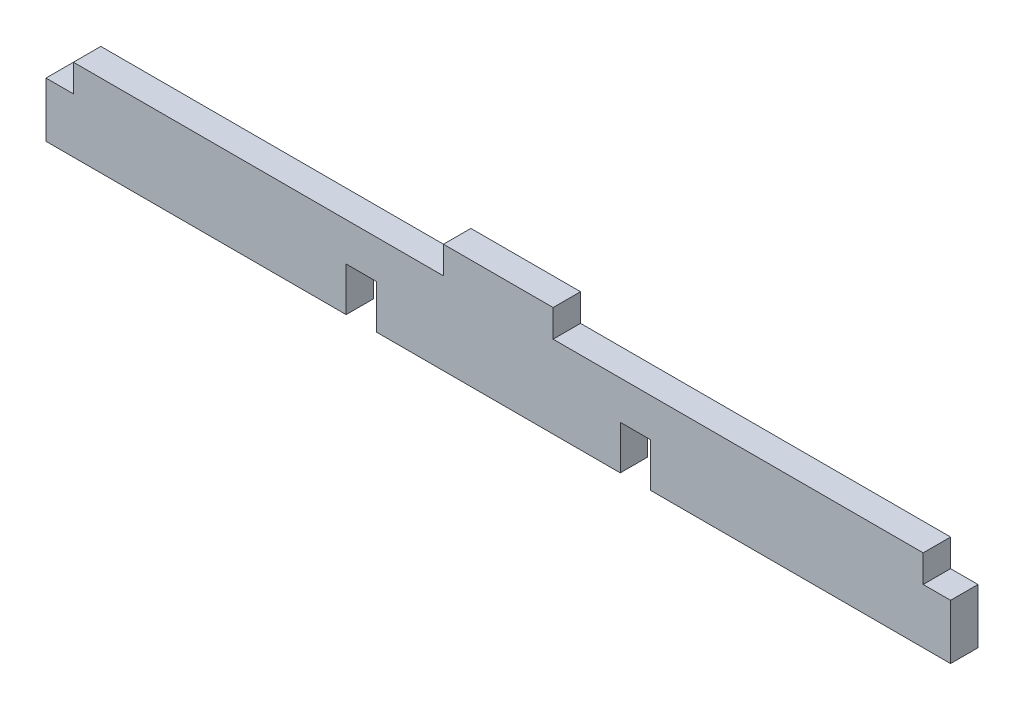
ISO-10303-21;
HEADER;
FILE_DESCRIPTION(('STEP AP214'),'2;1');
FILE_NAME('part.step','',(''),(''),'','','');
FILE_SCHEMA(('AUTOMOTIVE_DESIGN { 1 0 10303 214 1 1 1 1 }'));
ENDSEC;
DATA;
#1=APPLICATION_CONTEXT('core data for automotive mechanical design processes');
#2=APPLICATION_PROTOCOL_DEFINITION('international standard','automotive_design',2000,#1);
#3=PRODUCT_CONTEXT('',#1,'mechanical');
#4=PRODUCT('Part','Part','',(#3));
#5=PRODUCT_RELATED_PRODUCT_CATEGORY('part','',(#4));
#6=PRODUCT_DEFINITION_FORMATION('','',#4);
#7=PRODUCT_DEFINITION_CONTEXT('part definition',#1,'design');
#8=PRODUCT_DEFINITION('design','',#6,#7);
#9=PRODUCT_DEFINITION_SHAPE('','',#8);
#10=(LENGTH_UNIT() NAMED_UNIT(*) SI_UNIT(.MILLI.,.METRE.));
#11=(NAMED_UNIT(*) PLANE_ANGLE_UNIT() SI_UNIT($,.RADIAN.));
#12=(NAMED_UNIT(*) SI_UNIT($,.STERADIAN.) SOLID_ANGLE_UNIT());
#13=UNCERTAINTY_MEASURE_WITH_UNIT(LENGTH_MEASURE(1.E-05),#10,'distance_accuracy_value','');
#14=(GEOMETRIC_REPRESENTATION_CONTEXT(3) GLOBAL_UNCERTAINTY_ASSIGNED_CONTEXT((#13)) GLOBAL_UNIT_ASSIGNED_CONTEXT((#10,
#11,#12)) REPRESENTATION_CONTEXT('',''));
#15=CARTESIAN_POINT('',(0.,0.,0.));
#16=DIRECTION('',(0.,0.,1.));
#17=DIRECTION('',(1.,0.,0.));
#18=AXIS2_PLACEMENT_3D('',#15,#16,#17);
#19=CARTESIAN_POINT('',(443.795656842182,-203.645557824956,2.5));
#20=DIRECTION('',(0.,1.,0.));
#21=DIRECTION('',(0.,0.,1.));
#22=AXIS2_PLACEMENT_3D('',#19,#20,#21);
#23=PLANE('',#22);
#24=DIRECTION('',(1.,0.,0.));
#25=VECTOR('',#24,1.);
#26=CARTESIAN_POINT('',(443.795656842182,-203.645557824956,-2.5));
#27=LINE('',#26,#25);
#28=CARTESIAN_POINT('',(443.795656842182,-203.645557824956,-2.5));
#29=VERTEX_POINT('',#28);
#30=CARTESIAN_POINT('',(498.545659385881,-203.645557824956,-2.5));
#31=VERTEX_POINT('',#30);
#32=EDGE_CURVE('E200',#29,#31,#27,.T.);
#33=ORIENTED_EDGE('',*,*,#32,.T.);
#34=DIRECTION('',(0.,0.,-1.));
#35=VECTOR('',#34,1.);
#36=CARTESIAN_POINT('',(498.545659385881,-203.645557824956,2.5));
#37=LINE('',#36,#35);
#38=CARTESIAN_POINT('',(498.545659385881,-203.645557824956,2.5));
#39=VERTEX_POINT('',#38);
#40=EDGE_CURVE('E11',#39,#31,#37,.T.);
#41=ORIENTED_EDGE('',*,*,#40,.F.);
#42=DIRECTION('',(1.,0.,0.));
#43=VECTOR('',#42,1.);
#44=CARTESIAN_POINT('',(443.795656842182,-203.645557824956,2.5));
#45=LINE('',#44,#43);
#46=CARTESIAN_POINT('',(443.795656842182,-203.645557824956,2.5));
#47=VERTEX_POINT('',#46);
#48=EDGE_CURVE('E238',#47,#39,#45,.T.);
#49=ORIENTED_EDGE('',*,*,#48,.F.);
#50=DIRECTION('',(0.,0.,-1.));
#51=VECTOR('',#50,1.);
#52=CARTESIAN_POINT('',(443.795656842182,-203.645557824956,2.5));
#53=LINE('',#52,#51);
#54=EDGE_CURVE('E196',#47,#29,#53,.T.);
#55=ORIENTED_EDGE('',*,*,#54,.T.);
#56=EDGE_LOOP('',(#33,#41,#49,#55));
#57=FACE_BOUND('',#56,.T.);
#58=ADVANCED_FACE('F32',(#57),#23,.F.);
#59=CARTESIAN_POINT('',(498.545659385881,-203.645557824956,2.5));
#60=DIRECTION('',(-1.,0.,0.));
#61=DIRECTION('',(0.,0.,1.));
#62=AXIS2_PLACEMENT_3D('',#59,#60,#61);
#63=PLANE('',#62);
#64=DIRECTION('',(0.,1.,0.));
#65=VECTOR('',#64,1.);
#66=CARTESIAN_POINT('',(498.545659385881,-203.645557824956,-2.5));
#67=LINE('',#66,#65);
#68=CARTESIAN_POINT('',(498.545659385881,-193.645557824956,-2.5));
#69=VERTEX_POINT('',#68);
#70=EDGE_CURVE('E203',#31,#69,#67,.T.);
#71=ORIENTED_EDGE('',*,*,#70,.T.);
#72=DIRECTION('',(0.,0.,-1.));
#73=VECTOR('',#72,1.);
#74=CARTESIAN_POINT('',(498.545659385881,-193.645557824956,2.5));
#75=LINE('',#74,#73);
#76=CARTESIAN_POINT('',(498.545659385881,-193.645557824956,2.5));
#77=VERTEX_POINT('',#76);
#78=EDGE_CURVE('E40',#77,#69,#75,.T.);
#79=ORIENTED_EDGE('',*,*,#78,.F.);
#80=DIRECTION('',(0.,1.,0.));
#81=VECTOR('',#80,1.);
#82=CARTESIAN_POINT('',(498.545659385881,-203.645557824956,2.5));
#83=LINE('',#82,#81);
#84=EDGE_CURVE('E127',#39,#77,#83,.T.);
#85=ORIENTED_EDGE('',*,*,#84,.F.);
#86=ORIENTED_EDGE('',*,*,#40,.T.);
#87=EDGE_LOOP('',(#71,#79,#85,#86));
#88=FACE_BOUND('',#87,.T.);
#89=ADVANCED_FACE('F356',(#88),#63,.F.);
#90=CARTESIAN_POINT('',(498.545659385881,-193.645557824956,2.5));
#91=DIRECTION('',(0.,-1.,0.));
#92=DIRECTION('',(0.,0.,-1.));
#93=AXIS2_PLACEMENT_3D('',#90,#91,#92);
#94=PLANE('',#93);
#95=DIRECTION('',(-1.,0.,0.));
#96=VECTOR('',#95,1.);
#97=CARTESIAN_POINT('',(498.545659385881,-193.645557824956,-2.5));
#98=LINE('',#97,#96);
#99=CARTESIAN_POINT('',(493.545659385881,-193.645557824956,-2.5));
#100=VERTEX_POINT('',#99);
#101=EDGE_CURVE('E205',#69,#100,#98,.T.);
#102=ORIENTED_EDGE('',*,*,#101,.T.);
#103=DIRECTION('',(0.,0.,-1.));
#104=VECTOR('',#103,1.);
#105=CARTESIAN_POINT('',(493.545659385881,-193.645557824956,2.5));
#106=LINE('',#105,#104);
#107=CARTESIAN_POINT('',(493.545659385881,-193.645557824956,2.5));
#108=VERTEX_POINT('',#107);
#109=EDGE_CURVE('E281',#108,#100,#106,.T.);
#110=ORIENTED_EDGE('',*,*,#109,.F.);
#111=DIRECTION('',(-1.,0.,0.));
#112=VECTOR('',#111,1.);
#113=CARTESIAN_POINT('',(498.545659385881,-193.645557824956,2.5));
#114=LINE('',#113,#112);
#115=EDGE_CURVE('E289',#77,#108,#114,.T.);
#116=ORIENTED_EDGE('',*,*,#115,.F.);
#117=ORIENTED_EDGE('',*,*,#78,.T.);
#118=EDGE_LOOP('',(#102,#110,#116,#117));
#119=FACE_BOUND('',#118,.T.);
#120=ADVANCED_FACE('F287',(#119),#94,.F.);
#121=CARTESIAN_POINT('',(493.545659385881,-193.645557824956,2.5));
#122=DIRECTION('',(-1.,0.,0.));
#123=DIRECTION('',(0.,0.,1.));
#124=AXIS2_PLACEMENT_3D('',#121,#122,#123);
#125=PLANE('',#124);
#126=DIRECTION('',(0.,1.,0.));
#127=VECTOR('',#126,1.);
#128=CARTESIAN_POINT('',(493.545659385881,-193.645557824956,-2.5));
#129=LINE('',#128,#127);
#130=CARTESIAN_POINT('',(493.545659385881,-188.645557824956,-2.5));
#131=VERTEX_POINT('',#130);
#132=EDGE_CURVE('E207',#100,#131,#129,.T.);
#133=ORIENTED_EDGE('',*,*,#132,.T.);
#134=DIRECTION('',(0.,0.,-1.));
#135=VECTOR('',#134,1.);
#136=CARTESIAN_POINT('',(493.545659385881,-188.645557824956,2.5));
#137=LINE('',#136,#135);
#138=CARTESIAN_POINT('',(493.545659385881,-188.645557824956,2.5));
#139=VERTEX_POINT('',#138);
#140=EDGE_CURVE('E278',#139,#131,#137,.T.);
#141=ORIENTED_EDGE('',*,*,#140,.F.);
#142=DIRECTION('',(0.,1.,0.));
#143=VECTOR('',#142,1.);
#144=CARTESIAN_POINT('',(493.545659385881,-193.645557824956,2.5));
#145=LINE('',#144,#143);
#146=EDGE_CURVE('E307',#108,#139,#145,.T.);
#147=ORIENTED_EDGE('',*,*,#146,.F.);
#148=ORIENTED_EDGE('',*,*,#109,.T.);
#149=EDGE_LOOP('',(#133,#141,#147,#148));
#150=FACE_BOUND('',#149,.T.);
#151=ADVANCED_FACE('F298',(#150),#125,.F.);
#152=CARTESIAN_POINT('',(493.545659385881,-188.645557824956,2.5));
#153=DIRECTION('',(0.,-1.,0.));
#154=DIRECTION('',(0.,0.,-1.));
#155=AXIS2_PLACEMENT_3D('',#152,#153,#154);
#156=PLANE('',#155);
#157=DIRECTION('',(-1.,0.,0.));
#158=VECTOR('',#157,1.);
#159=CARTESIAN_POINT('',(493.545659385881,-188.645557824956,-2.5));
#160=LINE('',#159,#158);
#161=CARTESIAN_POINT('',(426.045659385881,-188.645557824956,-2.5));
#162=VERTEX_POINT('',#161);
#163=EDGE_CURVE('E209',#131,#162,#160,.T.);
#164=ORIENTED_EDGE('',*,*,#163,.T.);
#165=DIRECTION('',(0.,0.,-1.));
#166=VECTOR('',#165,1.);
#167=CARTESIAN_POINT('',(426.045659385881,-188.645557824956,2.5));
#168=LINE('',#167,#166);
#169=CARTESIAN_POINT('',(426.045659385881,-188.645557824956,2.5));
#170=VERTEX_POINT('',#169);
#171=EDGE_CURVE('E275',#170,#162,#168,.T.);
#172=ORIENTED_EDGE('',*,*,#171,.F.);
#173=DIRECTION('',(-1.,0.,0.));
#174=VECTOR('',#173,1.);
#175=CARTESIAN_POINT('',(493.545659385881,-188.645557824956,2.5));
#176=LINE('',#175,#174);
#177=EDGE_CURVE('E304',#139,#170,#176,.T.);
#178=ORIENTED_EDGE('',*,*,#177,.F.);
#179=ORIENTED_EDGE('',*,*,#140,.T.);
#180=EDGE_LOOP('',(#164,#172,#178,#179));
#181=FACE_BOUND('',#180,.T.);
#182=ADVANCED_FACE('F302',(#181),#156,.F.);
#183=CARTESIAN_POINT('',(426.045659385881,-188.645557824956,2.5));
#184=DIRECTION('',(-1.,0.,0.));
#185=DIRECTION('',(0.,0.,1.));
#186=AXIS2_PLACEMENT_3D('',#183,#184,#185);
#187=PLANE('',#186);
#188=DIRECTION('',(0.,1.,0.));
#189=VECTOR('',#188,1.);
#190=CARTESIAN_POINT('',(426.045659385881,-188.645557824956,-2.5));
#191=LINE('',#190,#189);
#192=CARTESIAN_POINT('',(426.045659385881,-183.645557824956,-2.5));
#193=VERTEX_POINT('',#192);
#194=EDGE_CURVE('E211',#162,#193,#191,.T.);
#195=ORIENTED_EDGE('',*,*,#194,.T.);
#196=DIRECTION('',(0.,0.,-1.));
#197=VECTOR('',#196,1.);
#198=CARTESIAN_POINT('',(426.045659385881,-183.645557824956,2.5));
#199=LINE('',#198,#197);
#200=CARTESIAN_POINT('',(426.045659385881,-183.645557824956,2.5));
#201=VERTEX_POINT('',#200);
#202=EDGE_CURVE('E272',#201,#193,#199,.T.);
#203=ORIENTED_EDGE('',*,*,#202,.F.);
#204=DIRECTION('',(0.,1.,0.));
#205=VECTOR('',#204,1.);
#206=CARTESIAN_POINT('',(426.045659385881,-188.645557824956,2.5));
#207=LINE('',#206,#205);
#208=EDGE_CURVE('E306',#170,#201,#207,.T.);
#209=ORIENTED_EDGE('',*,*,#208,.F.);
#210=ORIENTED_EDGE('',*,*,#171,.T.);
#211=EDGE_LOOP('',(#195,#203,#209,#210));
#212=FACE_BOUND('',#211,.T.);
#213=ADVANCED_FACE('F369',(#212),#187,.F.);
#214=CARTESIAN_POINT('',(426.045659385881,-183.645557824956,2.5));
#215=DIRECTION('',(0.,-1.,0.));
#216=DIRECTION('',(0.,0.,-1.));
#217=AXIS2_PLACEMENT_3D('',#214,#215,#216);
#218=PLANE('',#217);
#219=DIRECTION('',(-1.,0.,0.));
#220=VECTOR('',#219,1.);
#221=CARTESIAN_POINT('',(426.045659385881,-183.645557824956,-2.5));
#222=LINE('',#221,#220);
#223=CARTESIAN_POINT('',(406.045659385882,-183.645557824956,-2.5));
#224=VERTEX_POINT('',#223);
#225=EDGE_CURVE('E213',#193,#224,#222,.T.);
#226=ORIENTED_EDGE('',*,*,#225,.T.);
#227=DIRECTION('',(0.,0.,-1.));
#228=VECTOR('',#227,1.);
#229=CARTESIAN_POINT('',(406.045659385882,-183.645557824956,2.5));
#230=LINE('',#229,#228);
#231=CARTESIAN_POINT('',(406.045659385882,-183.645557824956,2.5));
#232=VERTEX_POINT('',#231);
#233=EDGE_CURVE('E269',#232,#224,#230,.T.);
#234=ORIENTED_EDGE('',*,*,#233,.F.);
#235=DIRECTION('',(-1.,0.,0.));
#236=VECTOR('',#235,1.);
#237=CARTESIAN_POINT('',(426.045659385881,-183.645557824956,2.5));
#238=LINE('',#237,#236);
#239=EDGE_CURVE('E309',#201,#232,#238,.T.);
#240=ORIENTED_EDGE('',*,*,#239,.F.);
#241=ORIENTED_EDGE('',*,*,#202,.T.);
#242=EDGE_LOOP('',(#226,#234,#240,#241));
#243=FACE_BOUND('',#242,.T.);
#244=ADVANCED_FACE('F372',(#243),#218,.F.);
#245=CARTESIAN_POINT('',(406.045659385882,-183.645557824956,2.5));
#246=DIRECTION('',(1.,-2.77555756156292E-13,0.));
#247=DIRECTION('',(2.77555756156292E-13,1.,0.));
#248=AXIS2_PLACEMENT_3D('',#245,#246,#247);
#249=PLANE('',#248);
#250=DIRECTION('',(-2.77555756156292E-13,-1.,0.));
#251=VECTOR('',#250,1.);
#252=CARTESIAN_POINT('',(406.045659385882,-183.645557824956,-2.5));
#253=LINE('',#252,#251);
#254=CARTESIAN_POINT('',(406.04565938588,-188.645557824956,-2.5));
#255=VERTEX_POINT('',#254);
#256=EDGE_CURVE('E215',#224,#255,#253,.T.);
#257=ORIENTED_EDGE('',*,*,#256,.T.);
#258=DIRECTION('',(0.,0.,-1.));
#259=VECTOR('',#258,1.);
#260=CARTESIAN_POINT('',(406.04565938588,-188.645557824956,2.5));
#261=LINE('',#260,#259);
#262=CARTESIAN_POINT('',(406.04565938588,-188.645557824956,2.5));
#263=VERTEX_POINT('',#262);
#264=EDGE_CURVE('E266',#263,#255,#261,.T.);
#265=ORIENTED_EDGE('',*,*,#264,.F.);
#266=DIRECTION('',(-2.77555756156292E-13,-1.,0.));
#267=VECTOR('',#266,1.);
#268=CARTESIAN_POINT('',(406.045659385882,-183.645557824956,2.5));
#269=LINE('',#268,#267);
#270=EDGE_CURVE('E315',#232,#263,#269,.T.);
#271=ORIENTED_EDGE('',*,*,#270,.F.);
#272=ORIENTED_EDGE('',*,*,#233,.T.);
#273=EDGE_LOOP('',(#257,#265,#271,#272));
#274=FACE_BOUND('',#273,.T.);
#275=ADVANCED_FACE('F376',(#274),#249,.F.);
#276=CARTESIAN_POINT('',(406.04565938588,-188.645557824956,2.5));
#277=DIRECTION('',(0.,-1.,0.));
#278=DIRECTION('',(0.,0.,-1.));
#279=AXIS2_PLACEMENT_3D('',#276,#277,#278);
#280=PLANE('',#279);
#281=DIRECTION('',(-1.,0.,0.));
#282=VECTOR('',#281,1.);
#283=CARTESIAN_POINT('',(406.04565938588,-188.645557824956,-2.5));
#284=LINE('',#283,#282);
#285=CARTESIAN_POINT('',(338.545659385881,-188.645557824956,-2.5));
#286=VERTEX_POINT('',#285);
#287=EDGE_CURVE('E217',#255,#286,#284,.T.);
#288=ORIENTED_EDGE('',*,*,#287,.T.);
#289=DIRECTION('',(0.,0.,-1.));
#290=VECTOR('',#289,1.);
#291=CARTESIAN_POINT('',(338.545659385881,-188.645557824956,2.5));
#292=LINE('',#291,#290);
#293=CARTESIAN_POINT('',(338.545659385881,-188.645557824956,2.5));
#294=VERTEX_POINT('',#293);
#295=EDGE_CURVE('E263',#294,#286,#292,.T.);
#296=ORIENTED_EDGE('',*,*,#295,.F.);
#297=DIRECTION('',(-1.,0.,0.));
#298=VECTOR('',#297,1.);
#299=CARTESIAN_POINT('',(406.04565938588,-188.645557824956,2.5));
#300=LINE('',#299,#298);
#301=EDGE_CURVE('E317',#263,#294,#300,.T.);
#302=ORIENTED_EDGE('',*,*,#301,.F.);
#303=ORIENTED_EDGE('',*,*,#264,.T.);
#304=EDGE_LOOP('',(#288,#296,#302,#303));
#305=FACE_BOUND('',#304,.T.);
#306=ADVANCED_FACE('F380',(#305),#280,.F.);
#307=CARTESIAN_POINT('',(338.545659385881,-188.645557824956,2.5));
#308=DIRECTION('',(1.,0.,0.));
#309=DIRECTION('',(0.,0.,-1.));
#310=AXIS2_PLACEMENT_3D('',#307,#308,#309);
#311=PLANE('',#310);
#312=DIRECTION('',(0.,-1.,0.));
#313=VECTOR('',#312,1.);
#314=CARTESIAN_POINT('',(338.545659385881,-188.645557824956,-2.5));
#315=LINE('',#314,#313);
#316=CARTESIAN_POINT('',(338.545659385881,-193.645557824956,-2.5));
#317=VERTEX_POINT('',#316);
#318=EDGE_CURVE('E219',#286,#317,#315,.T.);
#319=ORIENTED_EDGE('',*,*,#318,.T.);
#320=DIRECTION('',(0.,0.,-1.));
#321=VECTOR('',#320,1.);
#322=CARTESIAN_POINT('',(338.545659385881,-193.645557824956,2.5));
#323=LINE('',#322,#321);
#324=CARTESIAN_POINT('',(338.545659385881,-193.645557824956,2.5));
#325=VERTEX_POINT('',#324);
#326=EDGE_CURVE('E260',#325,#317,#323,.T.);
#327=ORIENTED_EDGE('',*,*,#326,.F.);
#328=DIRECTION('',(0.,-1.,0.));
#329=VECTOR('',#328,1.);
#330=CARTESIAN_POINT('',(338.545659385881,-188.645557824956,2.5));
#331=LINE('',#330,#329);
#332=EDGE_CURVE('E319',#294,#325,#331,.T.);
#333=ORIENTED_EDGE('',*,*,#332,.F.);
#334=ORIENTED_EDGE('',*,*,#295,.T.);
#335=EDGE_LOOP('',(#319,#327,#333,#334));
#336=FACE_BOUND('',#335,.T.);
#337=ADVANCED_FACE('F384',(#336),#311,.F.);
#338=CARTESIAN_POINT('',(338.545659385881,-193.645557824956,2.5));
#339=DIRECTION('',(0.,-1.,0.));
#340=DIRECTION('',(0.,0.,-1.));
#341=AXIS2_PLACEMENT_3D('',#338,#339,#340);
#342=PLANE('',#341);
#343=DIRECTION('',(-1.,0.,0.));
#344=VECTOR('',#343,1.);
#345=CARTESIAN_POINT('',(338.545659385881,-193.645557824956,-2.5));
#346=LINE('',#345,#344);
#347=CARTESIAN_POINT('',(333.545659385881,-193.645557824956,-2.5));
#348=VERTEX_POINT('',#347);
#349=EDGE_CURVE('E221',#317,#348,#346,.T.);
#350=ORIENTED_EDGE('',*,*,#349,.T.);
#351=DIRECTION('',(0.,0.,-1.));
#352=VECTOR('',#351,1.);
#353=CARTESIAN_POINT('',(333.545659385881,-193.645557824956,2.5));
#354=LINE('',#353,#352);
#355=CARTESIAN_POINT('',(333.545659385881,-193.645557824956,2.5));
#356=VERTEX_POINT('',#355);
#357=EDGE_CURVE('E257',#356,#348,#354,.T.);
#358=ORIENTED_EDGE('',*,*,#357,.F.);
#359=DIRECTION('',(-1.,0.,0.));
#360=VECTOR('',#359,1.);
#361=CARTESIAN_POINT('',(338.545659385881,-193.645557824956,2.5));
#362=LINE('',#361,#360);
#363=EDGE_CURVE('E321',#325,#356,#362,.T.);
#364=ORIENTED_EDGE('',*,*,#363,.F.);
#365=ORIENTED_EDGE('',*,*,#326,.T.);
#366=EDGE_LOOP('',(#350,#358,#364,#365));
#367=FACE_BOUND('',#366,.T.);
#368=ADVANCED_FACE('F388',(#367),#342,.F.);
#369=CARTESIAN_POINT('',(333.545659385881,-193.645557824956,2.5));
#370=DIRECTION('',(1.,0.,0.));
#371=DIRECTION('',(0.,0.,-1.));
#372=AXIS2_PLACEMENT_3D('',#369,#370,#371);
#373=PLANE('',#372);
#374=DIRECTION('',(0.,-1.,0.));
#375=VECTOR('',#374,1.);
#376=CARTESIAN_POINT('',(333.545659385881,-193.645557824956,-2.5));
#377=LINE('',#376,#375);
#378=CARTESIAN_POINT('',(333.545659385881,-203.645557824956,-2.5));
#379=VERTEX_POINT('',#378);
#380=EDGE_CURVE('E223',#348,#379,#377,.T.);
#381=ORIENTED_EDGE('',*,*,#380,.T.);
#382=DIRECTION('',(0.,0.,-1.));
#383=VECTOR('',#382,1.);
#384=CARTESIAN_POINT('',(333.545659385881,-203.645557824956,2.5));
#385=LINE('',#384,#383);
#386=CARTESIAN_POINT('',(333.545659385881,-203.645557824956,2.5));
#387=VERTEX_POINT('',#386);
#388=EDGE_CURVE('E254',#387,#379,#385,.T.);
#389=ORIENTED_EDGE('',*,*,#388,.F.);
#390=DIRECTION('',(0.,-1.,0.));
#391=VECTOR('',#390,1.);
#392=CARTESIAN_POINT('',(333.545659385881,-193.645557824956,2.5));
#393=LINE('',#392,#391);
#394=EDGE_CURVE('E323',#356,#387,#393,.T.);
#395=ORIENTED_EDGE('',*,*,#394,.F.);
#396=ORIENTED_EDGE('',*,*,#357,.T.);
#397=EDGE_LOOP('',(#381,#389,#395,#396));
#398=FACE_BOUND('',#397,.T.);
#399=ADVANCED_FACE('F392',(#398),#373,.F.);
#400=CARTESIAN_POINT('',(333.545659385881,-203.645557824956,2.5));
#401=DIRECTION('',(0.,1.,0.));
#402=DIRECTION('',(0.,0.,1.));
#403=AXIS2_PLACEMENT_3D('',#400,#401,#402);
#404=PLANE('',#403);
#405=DIRECTION('',(1.,0.,0.));
#406=VECTOR('',#405,1.);
#407=CARTESIAN_POINT('',(333.545659385881,-203.645557824956,-2.5));
#408=LINE('',#407,#406);
#409=CARTESIAN_POINT('',(388.295656842182,-203.645557824956,-2.5));
#410=VERTEX_POINT('',#409);
#411=EDGE_CURVE('E225',#379,#410,#408,.T.);
#412=ORIENTED_EDGE('',*,*,#411,.T.);
#413=DIRECTION('',(0.,0.,-1.));
#414=VECTOR('',#413,1.);
#415=CARTESIAN_POINT('',(388.295656842182,-203.645557824956,2.5));
#416=LINE('',#415,#414);
#417=CARTESIAN_POINT('',(388.295656842182,-203.645557824956,2.5));
#418=VERTEX_POINT('',#417);
#419=EDGE_CURVE('E251',#418,#410,#416,.T.);
#420=ORIENTED_EDGE('',*,*,#419,.F.);
#421=DIRECTION('',(1.,0.,0.));
#422=VECTOR('',#421,1.);
#423=CARTESIAN_POINT('',(333.545659385881,-203.645557824956,2.5));
#424=LINE('',#423,#422);
#425=EDGE_CURVE('E325',#387,#418,#424,.T.);
#426=ORIENTED_EDGE('',*,*,#425,.F.);
#427=ORIENTED_EDGE('',*,*,#388,.T.);
#428=EDGE_LOOP('',(#412,#420,#426,#427));
#429=FACE_BOUND('',#428,.T.);
#430=ADVANCED_FACE('F396',(#429),#404,.F.);
#431=CARTESIAN_POINT('',(388.295656842182,-195.645557824956,2.5));
#432=DIRECTION('',(-1.,0.,0.));
#433=DIRECTION('',(0.,0.,1.));
#434=AXIS2_PLACEMENT_3D('',#431,#432,#433);
#435=PLANE('',#434);
#436=DIRECTION('',(0.,1.,0.));
#437=VECTOR('',#436,1.);
#438=CARTESIAN_POINT('',(388.295656842182,-195.645557824956,-2.5));
#439=LINE('',#438,#437);
#440=CARTESIAN_POINT('',(388.295656842182,-195.645557824956,-2.5));
#441=VERTEX_POINT('',#440);
#442=EDGE_CURVE('E227',#410,#441,#439,.T.);
#443=ORIENTED_EDGE('',*,*,#442,.T.);
#444=DIRECTION('',(0.,0.,-1.));
#445=VECTOR('',#444,1.);
#446=CARTESIAN_POINT('',(388.295656842182,-195.645557824956,2.5));
#447=LINE('',#446,#445);
#448=CARTESIAN_POINT('',(388.295656842182,-195.645557824956,2.5));
#449=VERTEX_POINT('',#448);
#450=EDGE_CURVE('E248',#449,#441,#447,.T.);
#451=ORIENTED_EDGE('',*,*,#450,.F.);
#452=DIRECTION('',(0.,1.,0.));
#453=VECTOR('',#452,1.);
#454=CARTESIAN_POINT('',(388.295656842182,-195.645557824956,2.5));
#455=LINE('',#454,#453);
#456=EDGE_CURVE('E327',#418,#449,#455,.T.);
#457=ORIENTED_EDGE('',*,*,#456,.F.);
#458=ORIENTED_EDGE('',*,*,#419,.T.);
#459=EDGE_LOOP('',(#443,#451,#457,#458));
#460=FACE_BOUND('',#459,.T.);
#461=ADVANCED_FACE('F400',(#460),#435,.F.);
#462=CARTESIAN_POINT('',(393.795656842182,-195.645557824956,2.5));
#463=DIRECTION('',(0.,1.,0.));
#464=DIRECTION('',(0.,0.,1.));
#465=AXIS2_PLACEMENT_3D('',#462,#463,#464);
#466=PLANE('',#465);
#467=DIRECTION('',(1.,0.,0.));
#468=VECTOR('',#467,1.);
#469=CARTESIAN_POINT('',(393.795656842182,-195.645557824956,-2.5));
#470=LINE('',#469,#468);
#471=CARTESIAN_POINT('',(393.795656842182,-195.645557824956,-2.5));
#472=VERTEX_POINT('',#471);
#473=EDGE_CURVE('E229',#441,#472,#470,.T.);
#474=ORIENTED_EDGE('',*,*,#473,.T.);
#475=DIRECTION('',(0.,0.,-1.));
#476=VECTOR('',#475,1.);
#477=CARTESIAN_POINT('',(393.795656842182,-195.645557824956,2.5));
#478=LINE('',#477,#476);
#479=CARTESIAN_POINT('',(393.795656842182,-195.645557824956,2.5));
#480=VERTEX_POINT('',#479);
#481=EDGE_CURVE('E245',#480,#472,#478,.T.);
#482=ORIENTED_EDGE('',*,*,#481,.F.);
#483=DIRECTION('',(1.,0.,0.));
#484=VECTOR('',#483,1.);
#485=CARTESIAN_POINT('',(393.795656842182,-195.645557824956,2.5));
#486=LINE('',#485,#484);
#487=EDGE_CURVE('E329',#449,#480,#486,.T.);
#488=ORIENTED_EDGE('',*,*,#487,.F.);
#489=ORIENTED_EDGE('',*,*,#450,.T.);
#490=EDGE_LOOP('',(#474,#482,#488,#489));
#491=FACE_BOUND('',#490,.T.);
#492=ADVANCED_FACE('F404',(#491),#466,.F.);
#493=CARTESIAN_POINT('',(393.795656842182,-203.645557824956,2.5));
#494=DIRECTION('',(1.,0.,0.));
#495=DIRECTION('',(0.,0.,-1.));
#496=AXIS2_PLACEMENT_3D('',#493,#494,#495);
#497=PLANE('',#496);
#498=DIRECTION('',(0.,-1.,0.));
#499=VECTOR('',#498,1.);
#500=CARTESIAN_POINT('',(393.795656842182,-203.645557824956,-2.5));
#501=LINE('',#500,#499);
#502=CARTESIAN_POINT('',(393.795656842182,-203.645557824956,-2.5));
#503=VERTEX_POINT('',#502);
#504=EDGE_CURVE('E231',#472,#503,#501,.T.);
#505=ORIENTED_EDGE('',*,*,#504,.T.);
#506=DIRECTION('',(0.,0.,-1.));
#507=VECTOR('',#506,1.);
#508=CARTESIAN_POINT('',(393.795656842182,-203.645557824956,2.5));
#509=LINE('',#508,#507);
#510=CARTESIAN_POINT('',(393.795656842182,-203.645557824956,2.5));
#511=VERTEX_POINT('',#510);
#512=EDGE_CURVE('E242',#511,#503,#509,.T.);
#513=ORIENTED_EDGE('',*,*,#512,.F.);
#514=DIRECTION('',(0.,-1.,0.));
#515=VECTOR('',#514,1.);
#516=CARTESIAN_POINT('',(393.795656842182,-203.645557824956,2.5));
#517=LINE('',#516,#515);
#518=EDGE_CURVE('E331',#480,#511,#517,.T.);
#519=ORIENTED_EDGE('',*,*,#518,.F.);
#520=ORIENTED_EDGE('',*,*,#481,.T.);
#521=EDGE_LOOP('',(#505,#513,#519,#520));
#522=FACE_BOUND('',#521,.T.);
#523=ADVANCED_FACE('F337',(#522),#497,.F.);
#524=CARTESIAN_POINT('',(393.795656842182,-203.645557824956,2.5));
#525=DIRECTION('',(0.,1.,0.));
#526=DIRECTION('',(0.,0.,1.));
#527=AXIS2_PLACEMENT_3D('',#524,#525,#526);
#528=PLANE('',#527);
#529=DIRECTION('',(1.,0.,0.));
#530=VECTOR('',#529,1.);
#531=CARTESIAN_POINT('',(393.795656842182,-203.645557824956,-2.5));
#532=LINE('',#531,#530);
#533=CARTESIAN_POINT('',(438.295656842182,-203.645557824956,-2.5));
#534=VERTEX_POINT('',#533);
#535=EDGE_CURVE('E233',#503,#534,#532,.T.);
#536=ORIENTED_EDGE('',*,*,#535,.T.);
#537=DIRECTION('',(0.,0.,-1.));
#538=VECTOR('',#537,1.);
#539=CARTESIAN_POINT('',(438.295656842182,-203.645557824956,2.5));
#540=LINE('',#539,#538);
#541=CARTESIAN_POINT('',(438.295656842182,-203.645557824956,2.5));
#542=VERTEX_POINT('',#541);
#543=EDGE_CURVE('E191',#542,#534,#540,.T.);
#544=ORIENTED_EDGE('',*,*,#543,.F.);
#545=DIRECTION('',(1.,0.,0.));
#546=VECTOR('',#545,1.);
#547=CARTESIAN_POINT('',(393.795656842182,-203.645557824956,2.5));
#548=LINE('',#547,#546);
#549=EDGE_CURVE('E182',#511,#542,#548,.T.);
#550=ORIENTED_EDGE('',*,*,#549,.F.);
#551=ORIENTED_EDGE('',*,*,#512,.T.);
#552=EDGE_LOOP('',(#536,#544,#550,#551));
#553=FACE_BOUND('',#552,.T.);
#554=ADVANCED_FACE('F341',(#553),#528,.F.);
#555=CARTESIAN_POINT('',(438.295656842182,-195.645557824956,2.5));
#556=DIRECTION('',(-1.,0.,0.));
#557=DIRECTION('',(0.,0.,1.));
#558=AXIS2_PLACEMENT_3D('',#555,#556,#557);
#559=PLANE('',#558);
#560=DIRECTION('',(0.,1.,0.));
#561=VECTOR('',#560,1.);
#562=CARTESIAN_POINT('',(438.295656842182,-195.645557824956,-2.5));
#563=LINE('',#562,#561);
#564=CARTESIAN_POINT('',(438.295656842182,-195.645557824956,-2.5));
#565=VERTEX_POINT('',#564);
#566=EDGE_CURVE('E190',#534,#565,#563,.T.);
#567=ORIENTED_EDGE('',*,*,#566,.T.);
#568=DIRECTION('',(0.,0.,-1.));
#569=VECTOR('',#568,1.);
#570=CARTESIAN_POINT('',(438.295656842182,-195.645557824956,2.5));
#571=LINE('',#570,#569);
#572=CARTESIAN_POINT('',(438.295656842182,-195.645557824956,2.5));
#573=VERTEX_POINT('',#572);
#574=EDGE_CURVE('E187',#573,#565,#571,.T.);
#575=ORIENTED_EDGE('',*,*,#574,.F.);
#576=DIRECTION('',(0.,1.,0.));
#577=VECTOR('',#576,1.);
#578=CARTESIAN_POINT('',(438.295656842182,-195.645557824956,2.5));
#579=LINE('',#578,#577);
#580=EDGE_CURVE('E176',#542,#573,#579,.T.);
#581=ORIENTED_EDGE('',*,*,#580,.F.);
#582=ORIENTED_EDGE('',*,*,#543,.T.);
#583=EDGE_LOOP('',(#567,#575,#581,#582));
#584=FACE_BOUND('',#583,.T.);
#585=ADVANCED_FACE('F188',(#584),#559,.F.);
#586=CARTESIAN_POINT('',(443.795656842182,-195.645557824956,2.5));
#587=DIRECTION('',(0.,1.,0.));
#588=DIRECTION('',(0.,0.,1.));
#589=AXIS2_PLACEMENT_3D('',#586,#587,#588);
#590=PLANE('',#589);
#591=DIRECTION('',(1.,0.,0.));
#592=VECTOR('',#591,1.);
#593=CARTESIAN_POINT('',(443.795656842182,-195.645557824956,-2.5));
#594=LINE('',#593,#592);
#595=CARTESIAN_POINT('',(443.795656842182,-195.645557824956,-2.5));
#596=VERTEX_POINT('',#595);
#597=EDGE_CURVE('E113',#565,#596,#594,.T.);
#598=ORIENTED_EDGE('',*,*,#597,.T.);
#599=DIRECTION('',(0.,0.,-1.));
#600=VECTOR('',#599,1.);
#601=CARTESIAN_POINT('',(443.795656842182,-195.645557824956,2.5));
#602=LINE('',#601,#600);
#603=CARTESIAN_POINT('',(443.795656842182,-195.645557824956,2.5));
#604=VERTEX_POINT('',#603);
#605=EDGE_CURVE('E192',#604,#596,#602,.T.);
#606=ORIENTED_EDGE('',*,*,#605,.F.);
#607=DIRECTION('',(1.,0.,0.));
#608=VECTOR('',#607,1.);
#609=CARTESIAN_POINT('',(443.795656842182,-195.645557824956,2.5));
#610=LINE('',#609,#608);
#611=EDGE_CURVE('E180',#573,#604,#610,.T.);
#612=ORIENTED_EDGE('',*,*,#611,.F.);
#613=ORIENTED_EDGE('',*,*,#574,.T.);
#614=EDGE_LOOP('',(#598,#606,#612,#613));
#615=FACE_BOUND('',#614,.T.);
#616=ADVANCED_FACE('F194',(#615),#590,.F.);
#617=CARTESIAN_POINT('',(443.795656842182,-203.645557824956,2.5));
#618=DIRECTION('',(1.,0.,0.));
#619=DIRECTION('',(0.,0.,-1.));
#620=AXIS2_PLACEMENT_3D('',#617,#618,#619);
#621=PLANE('',#620);
#622=DIRECTION('',(0.,-1.,0.));
#623=VECTOR('',#622,1.);
#624=CARTESIAN_POINT('',(443.795656842182,-203.645557824956,-2.5));
#625=LINE('',#624,#623);
#626=EDGE_CURVE('E119',#596,#29,#625,.T.);
#627=ORIENTED_EDGE('',*,*,#626,.T.);
#628=ORIENTED_EDGE('',*,*,#54,.F.);
#629=DIRECTION('',(0.,-1.,0.));
#630=VECTOR('',#629,1.);
#631=CARTESIAN_POINT('',(443.795656842182,-203.645557824956,2.5));
#632=LINE('',#631,#630);
#633=EDGE_CURVE('E48',#604,#47,#632,.T.);
#634=ORIENTED_EDGE('',*,*,#633,.F.);
#635=ORIENTED_EDGE('',*,*,#605,.T.);
#636=EDGE_LOOP('',(#627,#628,#634,#635));
#637=FACE_BOUND('',#636,.T.);
#638=ADVANCED_FACE('F345',(#637),#621,.F.);
#639=CARTESIAN_POINT('',(0.,0.,2.5));
#640=DIRECTION('',(0.,0.,1.));
#641=DIRECTION('',(1.,0.,0.));
#642=AXIS2_PLACEMENT_3D('',#639,#640,#641);
#643=PLANE('',#642);
#644=ORIENTED_EDGE('',*,*,#48,.T.);
#645=ORIENTED_EDGE('',*,*,#84,.T.);
#646=ORIENTED_EDGE('',*,*,#115,.T.);
#647=ORIENTED_EDGE('',*,*,#146,.T.);
#648=ORIENTED_EDGE('',*,*,#177,.T.);
#649=ORIENTED_EDGE('',*,*,#208,.T.);
#650=ORIENTED_EDGE('',*,*,#239,.T.);
#651=ORIENTED_EDGE('',*,*,#270,.T.);
#652=ORIENTED_EDGE('',*,*,#301,.T.);
#653=ORIENTED_EDGE('',*,*,#332,.T.);
#654=ORIENTED_EDGE('',*,*,#363,.T.);
#655=ORIENTED_EDGE('',*,*,#394,.T.);
#656=ORIENTED_EDGE('',*,*,#425,.T.);
#657=ORIENTED_EDGE('',*,*,#456,.T.);
#658=ORIENTED_EDGE('',*,*,#487,.T.);
#659=ORIENTED_EDGE('',*,*,#518,.T.);
#660=ORIENTED_EDGE('',*,*,#549,.T.);
#661=ORIENTED_EDGE('',*,*,#580,.T.);
#662=ORIENTED_EDGE('',*,*,#611,.T.);
#663=ORIENTED_EDGE('',*,*,#633,.T.);
#664=EDGE_LOOP('',(#644,#645,#646,#647,#648,#649,#650,#651,#652,#653,#654,#655,#656,#657,#658,
#659,#660,#661,#662,#663));
#665=FACE_BOUND('',#664,.T.);
#666=ADVANCED_FACE('F178',(#665),#643,.T.);
#667=CARTESIAN_POINT('',(0.,0.,-2.5));
#668=DIRECTION('',(0.,0.,1.));
#669=DIRECTION('',(1.,0.,0.));
#670=AXIS2_PLACEMENT_3D('',#667,#668,#669);
#671=PLANE('',#670);
#672=ORIENTED_EDGE('',*,*,#32,.F.);
#673=ORIENTED_EDGE('',*,*,#626,.F.);
#674=ORIENTED_EDGE('',*,*,#597,.F.);
#675=ORIENTED_EDGE('',*,*,#566,.F.);
#676=ORIENTED_EDGE('',*,*,#535,.F.);
#677=ORIENTED_EDGE('',*,*,#504,.F.);
#678=ORIENTED_EDGE('',*,*,#473,.F.);
#679=ORIENTED_EDGE('',*,*,#442,.F.);
#680=ORIENTED_EDGE('',*,*,#411,.F.);
#681=ORIENTED_EDGE('',*,*,#380,.F.);
#682=ORIENTED_EDGE('',*,*,#349,.F.);
#683=ORIENTED_EDGE('',*,*,#318,.F.);
#684=ORIENTED_EDGE('',*,*,#287,.F.);
#685=ORIENTED_EDGE('',*,*,#256,.F.);
#686=ORIENTED_EDGE('',*,*,#225,.F.);
#687=ORIENTED_EDGE('',*,*,#194,.F.);
#688=ORIENTED_EDGE('',*,*,#163,.F.);
#689=ORIENTED_EDGE('',*,*,#132,.F.);
#690=ORIENTED_EDGE('',*,*,#101,.F.);
#691=ORIENTED_EDGE('',*,*,#70,.F.);
#692=EDGE_LOOP('',(#672,#673,#674,#675,#676,#677,#678,#679,#680,#681,#682,#683,#684,#685,#686,
#687,#688,#689,#690,#691));
#693=FACE_BOUND('',#692,.T.);
#694=ADVANCED_FACE('F293',(#693),#671,.F.);
#695=CLOSED_SHELL('',(#58,#89,#120,#151,#182,#213,#244,#275,#306,#337,#368,#399,#430,#461,#492,
#523,#554,#585,#616,#638,#666,#694));
#696=MANIFOLD_SOLID_BREP('B2',#695);
#697=ADVANCED_BREP_SHAPE_REPRESENTATION('',(#18,#696),#14);
#698=SHAPE_DEFINITION_REPRESENTATION(#9,#697);
ENDSEC;
END-ISO-10303-21;
